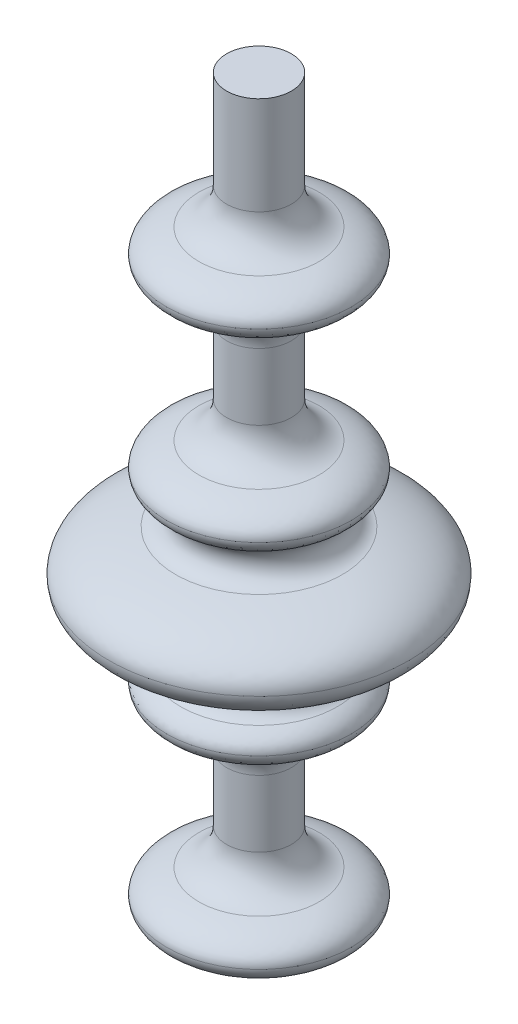
ISO-10303-21;
HEADER;
FILE_DESCRIPTION(('STEP AP214'),'2;1');
FILE_NAME('part.step','',(''),(''),'','','');
FILE_SCHEMA(('AUTOMOTIVE_DESIGN { 1 0 10303 214 1 1 1 1 }'));
ENDSEC;
DATA;
#1=APPLICATION_CONTEXT('core data for automotive mechanical design processes');
#2=APPLICATION_PROTOCOL_DEFINITION('international standard','automotive_design',2000,#1);
#3=PRODUCT_CONTEXT('',#1,'mechanical');
#4=PRODUCT('Part','Part','',(#3));
#5=PRODUCT_RELATED_PRODUCT_CATEGORY('part','',(#4));
#6=PRODUCT_DEFINITION_FORMATION('','',#4);
#7=PRODUCT_DEFINITION_CONTEXT('part definition',#1,'design');
#8=PRODUCT_DEFINITION('design','',#6,#7);
#9=PRODUCT_DEFINITION_SHAPE('','',#8);
#10=(LENGTH_UNIT() NAMED_UNIT(*) SI_UNIT(.MILLI.,.METRE.));
#11=(NAMED_UNIT(*) PLANE_ANGLE_UNIT() SI_UNIT($,.RADIAN.));
#12=(NAMED_UNIT(*) SI_UNIT($,.STERADIAN.) SOLID_ANGLE_UNIT());
#13=UNCERTAINTY_MEASURE_WITH_UNIT(LENGTH_MEASURE(1.E-05),#10,'distance_accuracy_value','');
#14=(GEOMETRIC_REPRESENTATION_CONTEXT(3) GLOBAL_UNCERTAINTY_ASSIGNED_CONTEXT((#13)) GLOBAL_UNIT_ASSIGNED_CONTEXT((#10,
#11,#12)) REPRESENTATION_CONTEXT('',''));
#15=CARTESIAN_POINT('',(0.,0.,0.));
#16=DIRECTION('',(0.,0.,1.));
#17=DIRECTION('',(1.,0.,0.));
#18=AXIS2_PLACEMENT_3D('',#15,#16,#17);
#19=CARTESIAN_POINT('',(0.,400.,0.));
#20=DIRECTION('',(0.,-1.,0.));
#21=DIRECTION('',(0.,0.,-1.));
#22=AXIS2_PLACEMENT_3D('',#19,#20,#21);
#23=CYLINDRICAL_SURFACE('',#22,17.5);
#24=CARTESIAN_POINT('',(0.,247.005382990447,0.));
#25=DIRECTION('',(0.,1.,0.));
#26=DIRECTION('',(-1.,0.,0.));
#27=AXIS2_PLACEMENT_3D('',#24,#25,#26);
#28=CIRCLE('',#27,17.5);
#29=CARTESIAN_POINT('',(-17.5,247.005382990447,0.));
#30=VERTEX_POINT('',#29);
#31=EDGE_CURVE('E259',#30,#30,#28,.T.);
#32=ORIENTED_EDGE('',*,*,#31,.T.);
#33=EDGE_LOOP('',(#32));
#34=FACE_BOUND('',#33,.T.);
#35=CARTESIAN_POINT('',(0.,282.994617009553,0.));
#36=DIRECTION('',(0.,-1.,0.));
#37=DIRECTION('',(1.,0.,0.));
#38=AXIS2_PLACEMENT_3D('',#35,#36,#37);
#39=CIRCLE('',#38,17.5);
#40=CARTESIAN_POINT('',(17.5,282.994617009553,0.));
#41=VERTEX_POINT('',#40);
#42=EDGE_CURVE('E261',#41,#41,#39,.T.);
#43=ORIENTED_EDGE('',*,*,#42,.T.);
#44=EDGE_LOOP('',(#43));
#45=FACE_BOUND('',#44,.T.);
#46=ADVANCED_FACE('F37',(#34,#45),#23,.T.);
#47=CARTESIAN_POINT('',(-49.9300695801296,215.,0.));
#48=CARTESIAN_POINT('',(-49.9300695801296,205.407519740713,0.));
#49=CARTESIAN_POINT('',(-29.665641003061,198.971479746419,0.));
#50=CARTESIAN_POINT('',(1.26287869051112E-13,198.97147974642,0.));
#51=B_SPLINE_CURVE_WITH_KNOTS('',3,(#47,#48,#49,#50),.UNSPECIFIED.,.F.,.F.,(4,4),(0.,1.),.UNSPECIFIED.);
#52=CARTESIAN_POINT('',(0.,315.,0.));
#53=DIRECTION('',(0.,1.,0.));
#54=AXIS1_PLACEMENT('',#52,#53);
#55=SURFACE_OF_REVOLUTION('',#51,#54);
#56=CARTESIAN_POINT('',(0.,205.96006907269,0.));
#57=DIRECTION('',(0.,1.,0.));
#58=DIRECTION('',(-1.,0.,0.));
#59=AXIS2_PLACEMENT_3D('',#56,#57,#58);
#60=CIRCLE('',#59,42.4421937216842);
#61=CARTESIAN_POINT('',(-42.4421937216842,205.96006907269,0.));
#62=VERTEX_POINT('',#61);
#63=EDGE_CURVE('E44',#62,#62,#60,.T.);
#64=ORIENTED_EDGE('',*,*,#63,.T.);
#65=EDGE_LOOP('',(#64));
#66=FACE_BOUND('',#65,.T.);
#67=CARTESIAN_POINT('',(0.,215.,0.));
#68=DIRECTION('',(0.,1.,0.));
#69=DIRECTION('',(-1.,0.,0.));
#70=AXIS2_PLACEMENT_3D('',#67,#68,#69);
#71=CIRCLE('',#70,49.9300695801297);
#72=CARTESIAN_POINT('',(-49.9300695801296,215.,0.));
#73=VERTEX_POINT('',#72);
#74=EDGE_CURVE('E61',#73,#73,#71,.T.);
#75=ORIENTED_EDGE('',*,*,#74,.F.);
#76=EDGE_LOOP('',(#75));
#77=FACE_BOUND('',#76,.T.);
#78=ADVANCED_FACE('F92',(#66,#77),#55,.F.);
#79=CARTESIAN_POINT('',(1.22124532708767E-13,231.02852025358,0.));
#80=CARTESIAN_POINT('',(-29.6656410030609,231.028520253581,0.));
#81=CARTESIAN_POINT('',(-49.9300695801296,224.592480259287,0.));
#82=CARTESIAN_POINT('',(-49.9300695801296,215.,0.));
#83=B_SPLINE_CURVE_WITH_KNOTS('',3,(#79,#80,#81,#82),.UNSPECIFIED.,.F.,.F.,(4,4),(0.,1.),.UNSPECIFIED.);
#84=CARTESIAN_POINT('',(0.,315.,0.));
#85=DIRECTION('',(0.,1.,0.));
#86=AXIS1_PLACEMENT('',#84,#85);
#87=SURFACE_OF_REVOLUTION('',#83,#86);
#88=CARTESIAN_POINT('',(0.,227.634219262441,0.));
#89=DIRECTION('',(0.,1.,0.));
#90=DIRECTION('',(-1.,0.,0.));
#91=AXIS2_PLACEMENT_3D('',#88,#89,#90);
#92=CIRCLE('',#91,32.5242572591865);
#93=CARTESIAN_POINT('',(-32.5242572591865,227.634219262441,0.));
#94=VERTEX_POINT('',#93);
#95=EDGE_CURVE('E256',#94,#94,#92,.F.);
#96=ORIENTED_EDGE('',*,*,#95,.T.);
#97=EDGE_LOOP('',(#96));
#98=FACE_BOUND('',#97,.T.);
#99=ORIENTED_EDGE('',*,*,#74,.T.);
#100=EDGE_LOOP('',(#99));
#101=FACE_BOUND('',#100,.T.);
#102=ADVANCED_FACE('F87',(#98,#101),#87,.F.);
#103=CARTESIAN_POINT('',(-49.9300695801296,315.,0.));
#104=CARTESIAN_POINT('',(-49.9300695801296,305.407519740713,0.));
#105=CARTESIAN_POINT('',(-29.665641003061,298.971479746419,0.));
#106=CARTESIAN_POINT('',(1.38777878078145E-13,298.97147974642,0.));
#107=B_SPLINE_CURVE_WITH_KNOTS('',3,(#103,#104,#105,#106),.UNSPECIFIED.,.F.,.F.,(4,4),(0.,1.),.UNSPECIFIED.);
#108=CARTESIAN_POINT('',(0.,315.,0.));
#109=DIRECTION('',(0.,1.,0.));
#110=AXIS1_PLACEMENT('',#108,#109);
#111=SURFACE_OF_REVOLUTION('',#107,#110);
#112=CARTESIAN_POINT('',(0.,302.365780737559,0.));
#113=DIRECTION('',(0.,1.,0.));
#114=DIRECTION('',(-1.,0.,0.));
#115=AXIS2_PLACEMENT_3D('',#112,#113,#114);
#116=CIRCLE('',#115,32.5242572591865);
#117=CARTESIAN_POINT('',(-32.5242572591865,302.365780737559,0.));
#118=VERTEX_POINT('',#117);
#119=EDGE_CURVE('E251',#118,#118,#116,.T.);
#120=ORIENTED_EDGE('',*,*,#119,.T.);
#121=EDGE_LOOP('',(#120));
#122=FACE_BOUND('',#121,.T.);
#123=CARTESIAN_POINT('',(0.,315.,0.));
#124=DIRECTION('',(0.,1.,0.));
#125=DIRECTION('',(-1.,0.,0.));
#126=AXIS2_PLACEMENT_3D('',#123,#124,#125);
#127=CIRCLE('',#126,49.9300695801296);
#128=CARTESIAN_POINT('',(-49.9300695801296,315.,0.));
#129=VERTEX_POINT('',#128);
#130=EDGE_CURVE('E57',#129,#129,#127,.T.);
#131=ORIENTED_EDGE('',*,*,#130,.F.);
#132=EDGE_LOOP('',(#131));
#133=FACE_BOUND('',#132,.T.);
#134=ADVANCED_FACE('F82',(#122,#133),#111,.F.);
#135=CARTESIAN_POINT('',(1.346145417358E-13,331.02852025358,0.));
#136=CARTESIAN_POINT('',(-29.6656410030609,331.028520253581,0.));
#137=CARTESIAN_POINT('',(-49.9300695801296,324.592480259287,0.));
#138=CARTESIAN_POINT('',(-49.9300695801296,315.,0.));
#139=B_SPLINE_CURVE_WITH_KNOTS('',3,(#135,#136,#137,#138),.UNSPECIFIED.,.F.,.F.,(4,4),(0.,1.),.UNSPECIFIED.);
#140=CARTESIAN_POINT('',(0.,315.,0.));
#141=DIRECTION('',(0.,1.,0.));
#142=AXIS1_PLACEMENT('',#140,#141);
#143=SURFACE_OF_REVOLUTION('',#139,#142);
#144=CARTESIAN_POINT('',(0.,327.634219262441,0.));
#145=DIRECTION('',(0.,1.,0.));
#146=DIRECTION('',(-1.,0.,0.));
#147=AXIS2_PLACEMENT_3D('',#144,#145,#146);
#148=CIRCLE('',#147,32.5242572591866);
#149=CARTESIAN_POINT('',(-32.5242572591866,327.634219262441,0.));
#150=VERTEX_POINT('',#149);
#151=EDGE_CURVE('E187',#150,#150,#148,.F.);
#152=ORIENTED_EDGE('',*,*,#151,.T.);
#153=EDGE_LOOP('',(#152));
#154=FACE_BOUND('',#153,.T.);
#155=ORIENTED_EDGE('',*,*,#130,.T.);
#156=EDGE_LOOP('',(#155));
#157=FACE_BOUND('',#156,.T.);
#158=ADVANCED_FACE('F86',(#154,#157),#143,.F.);
#159=CARTESIAN_POINT('',(0.,400.,0.));
#160=DIRECTION('',(0.,1.,0.));
#161=DIRECTION('',(0.,0.,1.));
#162=AXIS2_PLACEMENT_3D('',#159,#160,#161);
#163=PLANE('',#162);
#164=CARTESIAN_POINT('',(0.,400.,0.));
#165=DIRECTION('',(0.,1.,0.));
#166=DIRECTION('',(0.,0.,1.));
#167=AXIS2_PLACEMENT_3D('',#164,#165,#166);
#168=CIRCLE('',#167,17.5);
#169=CARTESIAN_POINT('',(0.,400.,17.5));
#170=VERTEX_POINT('',#169);
#171=EDGE_CURVE('E108',#170,#170,#168,.T.);
#172=ORIENTED_EDGE('',*,*,#171,.T.);
#173=EDGE_LOOP('',(#172));
#174=FACE_BOUND('',#173,.T.);
#175=ADVANCED_FACE('F175',(#174),#163,.T.);
#176=CARTESIAN_POINT('',(0.,347.005382990447,0.));
#177=DIRECTION('',(0.,1.,0.));
#178=DIRECTION('',(-1.,0.,0.));
#179=AXIS2_PLACEMENT_3D('',#176,#177,#178);
#180=CIRCLE('',#179,17.5);
#181=CARTESIAN_POINT('',(-17.5,347.005382990447,0.));
#182=VERTEX_POINT('',#181);
#183=EDGE_CURVE('E184',#182,#182,#180,.T.);
#184=ORIENTED_EDGE('',*,*,#183,.T.);
#185=EDGE_LOOP('',(#184));
#186=FACE_BOUND('',#185,.T.);
#187=ORIENTED_EDGE('',*,*,#171,.F.);
#188=EDGE_LOOP('',(#187));
#189=FACE_BOUND('',#188,.T.);
#190=ADVANCED_FACE('F136',(#186,#189),#23,.T.);
#191=CARTESIAN_POINT('',(0.,247.005382990447,0.));
#192=DIRECTION('',(0.,1.,0.));
#193=DIRECTION('',(-1.,0.,0.));
#194=AXIS2_PLACEMENT_3D('',#191,#192,#193);
#195=TOROIDAL_SURFACE('',#194,37.5,20.);
#196=ORIENTED_EDGE('',*,*,#95,.F.);
#197=EDGE_LOOP('',(#196));
#198=FACE_BOUND('',#197,.T.);
#199=ORIENTED_EDGE('',*,*,#31,.F.);
#200=EDGE_LOOP('',(#199));
#201=FACE_BOUND('',#200,.T.);
#202=ADVANCED_FACE('F132',(#198,#201),#195,.F.);
#203=CARTESIAN_POINT('',(0.,282.994617009553,0.));
#204=DIRECTION('',(0.,-1.,0.));
#205=DIRECTION('',(1.,0.,0.));
#206=AXIS2_PLACEMENT_3D('',#203,#204,#205);
#207=TOROIDAL_SURFACE('',#206,37.5,20.);
#208=ORIENTED_EDGE('',*,*,#119,.F.);
#209=EDGE_LOOP('',(#208));
#210=FACE_BOUND('',#209,.T.);
#211=ORIENTED_EDGE('',*,*,#42,.F.);
#212=EDGE_LOOP('',(#211));
#213=FACE_BOUND('',#212,.T.);
#214=ADVANCED_FACE('F135',(#210,#213),#207,.F.);
#215=CARTESIAN_POINT('',(0.,347.005382990447,0.));
#216=DIRECTION('',(0.,1.,0.));
#217=DIRECTION('',(-1.,0.,0.));
#218=AXIS2_PLACEMENT_3D('',#215,#216,#217);
#219=TOROIDAL_SURFACE('',#218,37.5,20.);
#220=ORIENTED_EDGE('',*,*,#151,.F.);
#221=EDGE_LOOP('',(#220));
#222=FACE_BOUND('',#221,.T.);
#223=ORIENTED_EDGE('',*,*,#183,.F.);
#224=EDGE_LOOP('',(#223));
#225=FACE_BOUND('',#224,.T.);
#226=ADVANCED_FACE('F140',(#222,#225),#219,.F.);
#227=CARTESIAN_POINT('',(-81.1363630677106,165.,0.));
#228=CARTESIAN_POINT('',(-81.1363630677106,149.412219578659,0.));
#229=CARTESIAN_POINT('',(-48.2066666299741,138.953654587932,0.));
#230=CARTESIAN_POINT('',(2.27769192395755E-13,138.953654587932,0.));
#231=B_SPLINE_CURVE_WITH_KNOTS('',3,(#227,#228,#229,#230),.UNSPECIFIED.,.F.,.F.,(4,4),(0.,1.),.UNSPECIFIED.);
#232=CARTESIAN_POINT('',(0.,215.,0.));
#233=DIRECTION('',(0.,1.,0.));
#234=AXIS1_PLACEMENT('',#232,#233);
#235=SURFACE_OF_REVOLUTION('',#231,#234);
#236=CARTESIAN_POINT('',(0.,142.737445828142,0.));
#237=DIRECTION('',(0.,1.,0.));
#238=DIRECTION('',(-1.,0.,0.));
#239=AXIS2_PLACEMENT_3D('',#236,#237,#238);
#240=CIRCLE('',#239,45.1265361152602);
#241=CARTESIAN_POINT('',(-45.1265361152602,142.737445828142,0.));
#242=VERTEX_POINT('',#241);
#243=EDGE_CURVE('E200',#242,#242,#240,.T.);
#244=ORIENTED_EDGE('',*,*,#243,.T.);
#245=EDGE_LOOP('',(#244));
#246=FACE_BOUND('',#245,.T.);
#247=CARTESIAN_POINT('',(0.,165.,0.));
#248=DIRECTION('',(0.,1.,0.));
#249=DIRECTION('',(-1.,0.,0.));
#250=AXIS2_PLACEMENT_3D('',#247,#248,#249);
#251=CIRCLE('',#250,81.1363630677106);
#252=CARTESIAN_POINT('',(-81.1363630677106,165.,0.));
#253=VERTEX_POINT('',#252);
#254=EDGE_CURVE('E58',#253,#253,#251,.T.);
#255=ORIENTED_EDGE('',*,*,#254,.F.);
#256=EDGE_LOOP('',(#255));
#257=FACE_BOUND('',#256,.T.);
#258=ADVANCED_FACE('F151',(#246,#257),#235,.F.);
#259=CARTESIAN_POINT('',(2.21003770839445E-13,191.046345412068,0.));
#260=CARTESIAN_POINT('',(-48.2066666299739,191.046345412068,0.));
#261=CARTESIAN_POINT('',(-81.1363630677106,180.587780421341,0.));
#262=CARTESIAN_POINT('',(-81.1363630677106,165.,0.));
#263=B_SPLINE_CURVE_WITH_KNOTS('',3,(#259,#260,#261,#262),.UNSPECIFIED.,.F.,.F.,(4,4),(0.,1.),.UNSPECIFIED.);
#264=CARTESIAN_POINT('',(0.,215.,0.));
#265=DIRECTION('',(0.,1.,0.));
#266=AXIS1_PLACEMENT('',#264,#265);
#267=SURFACE_OF_REVOLUTION('',#263,#266);
#268=CARTESIAN_POINT('',(0.,187.262554171858,0.));
#269=DIRECTION('',(0.,1.,0.));
#270=DIRECTION('',(-1.,0.,0.));
#271=AXIS2_PLACEMENT_3D('',#268,#269,#270);
#272=CIRCLE('',#271,45.1265361152604);
#273=CARTESIAN_POINT('',(-45.1265361152604,187.262554171858,0.));
#274=VERTEX_POINT('',#273);
#275=EDGE_CURVE('E11',#274,#274,#272,.F.);
#276=ORIENTED_EDGE('',*,*,#275,.T.);
#277=EDGE_LOOP('',(#276));
#278=FACE_BOUND('',#277,.T.);
#279=ORIENTED_EDGE('',*,*,#254,.T.);
#280=EDGE_LOOP('',(#279));
#281=FACE_BOUND('',#280,.T.);
#282=ADVANCED_FACE('F51',(#278,#281),#267,.F.);
#283=CARTESIAN_POINT('',(-49.9300695801296,15.,0.));
#284=CARTESIAN_POINT('',(-49.9300695801296,5.40751974071298,0.));
#285=CARTESIAN_POINT('',(-29.665641003061,-1.02852025358056,0.));
#286=CARTESIAN_POINT('',(1.51267887105178E-13,-1.02852025358029,0.));
#287=B_SPLINE_CURVE_WITH_KNOTS('',3,(#283,#284,#285,#286),.UNSPECIFIED.,.F.,.F.,(4,4),(0.,1.),.UNSPECIFIED.);
#288=CARTESIAN_POINT('',(0.,315.,0.));
#289=DIRECTION('',(0.,1.,0.));
#290=AXIS1_PLACEMENT('',#288,#289);
#291=SURFACE_OF_REVOLUTION('',#287,#290);
#292=CARTESIAN_POINT('',(0.,-1.02852025358025,0.));
#293=VERTEX_POINT('',#292);
#294=VERTEX_LOOP('',#293);
#295=FACE_BOUND('',#294,.T.);
#296=CARTESIAN_POINT('',(0.,15.,0.));
#297=DIRECTION('',(0.,1.,0.));
#298=DIRECTION('',(-1.,0.,0.));
#299=AXIS2_PLACEMENT_3D('',#296,#297,#298);
#300=CIRCLE('',#299,49.9300695801297);
#301=CARTESIAN_POINT('',(-49.9300695801296,15.,0.));
#302=VERTEX_POINT('',#301);
#303=EDGE_CURVE('E55',#302,#302,#300,.T.);
#304=ORIENTED_EDGE('',*,*,#303,.F.);
#305=EDGE_LOOP('',(#304));
#306=FACE_BOUND('',#305,.T.);
#307=ADVANCED_FACE('F47',(#295,#306),#291,.F.);
#308=CARTESIAN_POINT('',(1.47104550762833E-13,31.0285202535802,0.));
#309=CARTESIAN_POINT('',(-29.6656410030609,31.0285202535806,0.));
#310=CARTESIAN_POINT('',(-49.9300695801296,24.592480259287,0.));
#311=CARTESIAN_POINT('',(-49.9300695801296,15.,0.));
#312=B_SPLINE_CURVE_WITH_KNOTS('',3,(#308,#309,#310,#311),.UNSPECIFIED.,.F.,.F.,(4,4),(0.,1.),.UNSPECIFIED.);
#313=CARTESIAN_POINT('',(0.,315.,0.));
#314=DIRECTION('',(0.,1.,0.));
#315=AXIS1_PLACEMENT('',#313,#314);
#316=SURFACE_OF_REVOLUTION('',#312,#315);
#317=CARTESIAN_POINT('',(0.,27.6342192624408,0.));
#318=DIRECTION('',(0.,1.,0.));
#319=DIRECTION('',(-1.,0.,0.));
#320=AXIS2_PLACEMENT_3D('',#317,#318,#319);
#321=CIRCLE('',#320,32.5242572591866);
#322=CARTESIAN_POINT('',(-32.5242572591865,27.6342192624407,0.));
#323=VERTEX_POINT('',#322);
#324=EDGE_CURVE('E188',#323,#323,#321,.F.);
#325=ORIENTED_EDGE('',*,*,#324,.T.);
#326=EDGE_LOOP('',(#325));
#327=FACE_BOUND('',#326,.T.);
#328=ORIENTED_EDGE('',*,*,#303,.T.);
#329=EDGE_LOOP('',(#328));
#330=FACE_BOUND('',#329,.T.);
#331=ADVANCED_FACE('F50',(#327,#330),#316,.F.);
#332=CARTESIAN_POINT('',(0.,47.0053829904475,0.));
#333=DIRECTION('',(0.,1.,0.));
#334=DIRECTION('',(-1.,0.,0.));
#335=AXIS2_PLACEMENT_3D('',#332,#333,#334);
#336=TOROIDAL_SURFACE('',#335,37.5,20.);
#337=ORIENTED_EDGE('',*,*,#324,.F.);
#338=EDGE_LOOP('',(#337));
#339=FACE_BOUND('',#338,.T.);
#340=CARTESIAN_POINT('',(0.,47.0053829904475,0.));
#341=DIRECTION('',(0.,1.,0.));
#342=DIRECTION('',(-1.,0.,0.));
#343=AXIS2_PLACEMENT_3D('',#340,#341,#342);
#344=CIRCLE('',#343,17.5);
#345=CARTESIAN_POINT('',(-17.5,47.0053829904475,0.));
#346=VERTEX_POINT('',#345);
#347=EDGE_CURVE('E245',#346,#346,#344,.T.);
#348=ORIENTED_EDGE('',*,*,#347,.F.);
#349=EDGE_LOOP('',(#348));
#350=FACE_BOUND('',#349,.T.);
#351=ADVANCED_FACE('F146',(#339,#350),#336,.F.);
#352=CARTESIAN_POINT('',(0.,82.9946170095525,0.));
#353=DIRECTION('',(0.,1.,0.));
#354=DIRECTION('',(-1.,0.,0.));
#355=AXIS2_PLACEMENT_3D('',#352,#353,#354);
#356=CIRCLE('',#355,17.5);
#357=CARTESIAN_POINT('',(-17.5,82.9946170095525,0.));
#358=VERTEX_POINT('',#357);
#359=EDGE_CURVE('E194',#358,#358,#356,.F.);
#360=ORIENTED_EDGE('',*,*,#359,.T.);
#361=EDGE_LOOP('',(#360));
#362=FACE_BOUND('',#361,.T.);
#363=ORIENTED_EDGE('',*,*,#347,.T.);
#364=EDGE_LOOP('',(#363));
#365=FACE_BOUND('',#364,.T.);
#366=ADVANCED_FACE('F144',(#362,#365),#23,.T.);
#367=CARTESIAN_POINT('',(0.,82.9946170095525,0.));
#368=DIRECTION('',(0.,1.,0.));
#369=DIRECTION('',(-1.,0.,0.));
#370=AXIS2_PLACEMENT_3D('',#367,#368,#369);
#371=TOROIDAL_SURFACE('',#370,37.5,20.);
#372=ORIENTED_EDGE('',*,*,#359,.F.);
#373=EDGE_LOOP('',(#372));
#374=FACE_BOUND('',#373,.T.);
#375=CARTESIAN_POINT('',(0.,102.365780737559,0.));
#376=DIRECTION('',(0.,1.,0.));
#377=DIRECTION('',(-1.,0.,0.));
#378=AXIS2_PLACEMENT_3D('',#375,#376,#377);
#379=CIRCLE('',#378,32.5242572591865);
#380=CARTESIAN_POINT('',(-32.5242572591864,102.365780737559,0.));
#381=VERTEX_POINT('',#380);
#382=EDGE_CURVE('E247',#381,#381,#379,.T.);
#383=ORIENTED_EDGE('',*,*,#382,.F.);
#384=EDGE_LOOP('',(#383));
#385=FACE_BOUND('',#384,.T.);
#386=ADVANCED_FACE('F129',(#374,#385),#371,.F.);
#387=CARTESIAN_POINT('',(-49.9300695801297,115.,0.));
#388=CARTESIAN_POINT('',(-49.9300695801297,105.407519740713,0.));
#389=CARTESIAN_POINT('',(-29.665641003061,98.9714797464194,0.));
#390=CARTESIAN_POINT('',(1.1518563880486E-13,98.9714797464197,0.));
#391=B_SPLINE_CURVE_WITH_KNOTS('',3,(#387,#388,#389,#390),.UNSPECIFIED.,.F.,.F.,(4,4),(0.,1.),.UNSPECIFIED.);
#392=CARTESIAN_POINT('',(0.,315.,0.));
#393=DIRECTION('',(0.,1.,0.));
#394=AXIS1_PLACEMENT('',#392,#393);
#395=SURFACE_OF_REVOLUTION('',#391,#394);
#396=ORIENTED_EDGE('',*,*,#382,.T.);
#397=EDGE_LOOP('',(#396));
#398=FACE_BOUND('',#397,.T.);
#399=CARTESIAN_POINT('',(0.,115.,0.));
#400=DIRECTION('',(0.,1.,0.));
#401=DIRECTION('',(-1.,0.,0.));
#402=AXIS2_PLACEMENT_3D('',#399,#400,#401);
#403=CIRCLE('',#402,49.9300695801297);
#404=CARTESIAN_POINT('',(-49.9300695801297,115.,0.));
#405=VERTEX_POINT('',#404);
#406=EDGE_CURVE('E111',#405,#405,#403,.T.);
#407=ORIENTED_EDGE('',*,*,#406,.F.);
#408=EDGE_LOOP('',(#407));
#409=FACE_BOUND('',#408,.T.);
#410=ADVANCED_FACE('F124',(#398,#409),#395,.F.);
#411=CARTESIAN_POINT('',(1.11022302462516E-13,131.02852025358,0.));
#412=CARTESIAN_POINT('',(-29.6656410030609,131.028520253581,0.));
#413=CARTESIAN_POINT('',(-49.9300695801297,124.592480259287,0.));
#414=CARTESIAN_POINT('',(-49.9300695801297,115.,0.));
#415=B_SPLINE_CURVE_WITH_KNOTS('',3,(#411,#412,#413,#414),.UNSPECIFIED.,.F.,.F.,(4,4),(0.,1.),.UNSPECIFIED.);
#416=CARTESIAN_POINT('',(0.,315.,0.));
#417=DIRECTION('',(0.,1.,0.));
#418=AXIS1_PLACEMENT('',#416,#417);
#419=SURFACE_OF_REVOLUTION('',#415,#418);
#420=CARTESIAN_POINT('',(0.,124.03993092731,0.));
#421=DIRECTION('',(0.,1.,0.));
#422=DIRECTION('',(-1.,0.,0.));
#423=AXIS2_PLACEMENT_3D('',#420,#421,#422);
#424=CIRCLE('',#423,42.4421937216842);
#425=CARTESIAN_POINT('',(-42.4421937216841,124.03993092731,0.));
#426=VERTEX_POINT('',#425);
#427=EDGE_CURVE('E191',#426,#426,#424,.F.);
#428=ORIENTED_EDGE('',*,*,#427,.T.);
#429=EDGE_LOOP('',(#428));
#430=FACE_BOUND('',#429,.T.);
#431=ORIENTED_EDGE('',*,*,#406,.T.);
#432=EDGE_LOOP('',(#431));
#433=FACE_BOUND('',#432,.T.);
#434=ADVANCED_FACE('F128',(#430,#433),#419,.F.);
#435=CARTESIAN_POINT('',(0.,132.92168306044,0.));
#436=DIRECTION('',(0.,-1.,0.));
#437=DIRECTION('',(1.,0.,0.));
#438=AXIS2_PLACEMENT_3D('',#435,#436,#437);
#439=TOROIDAL_SURFACE('',#438,47.0372431279086,10.);
#440=ORIENTED_EDGE('',*,*,#243,.F.);
#441=EDGE_LOOP('',(#440));
#442=FACE_BOUND('',#441,.T.);
#443=ORIENTED_EDGE('',*,*,#427,.F.);
#444=EDGE_LOOP('',(#443));
#445=FACE_BOUND('',#444,.T.);
#446=ADVANCED_FACE('F153',(#442,#445),#439,.F.);
#447=CARTESIAN_POINT('',(0.,197.07831693956,0.));
#448=DIRECTION('',(0.,1.,0.));
#449=DIRECTION('',(-1.,0.,0.));
#450=AXIS2_PLACEMENT_3D('',#447,#448,#449);
#451=TOROIDAL_SURFACE('',#450,47.0372431279087,10.);
#452=ORIENTED_EDGE('',*,*,#275,.F.);
#453=EDGE_LOOP('',(#452));
#454=FACE_BOUND('',#453,.T.);
#455=ORIENTED_EDGE('',*,*,#63,.F.);
#456=EDGE_LOOP('',(#455));
#457=FACE_BOUND('',#456,.T.);
#458=ADVANCED_FACE('F39',(#454,#457),#451,.F.);
#459=CLOSED_SHELL('',(#46,#78,#102,#134,#158,#175,#190,#202,#214,#226,#258,#282,#307,#331,#351,
#366,#386,#410,#434,#446,#458));
#460=MANIFOLD_SOLID_BREP('B2',#459);
#461=ADVANCED_BREP_SHAPE_REPRESENTATION('',(#18,#460),#14);
#462=SHAPE_DEFINITION_REPRESENTATION(#9,#461);
ENDSEC;
END-ISO-10303-21;
